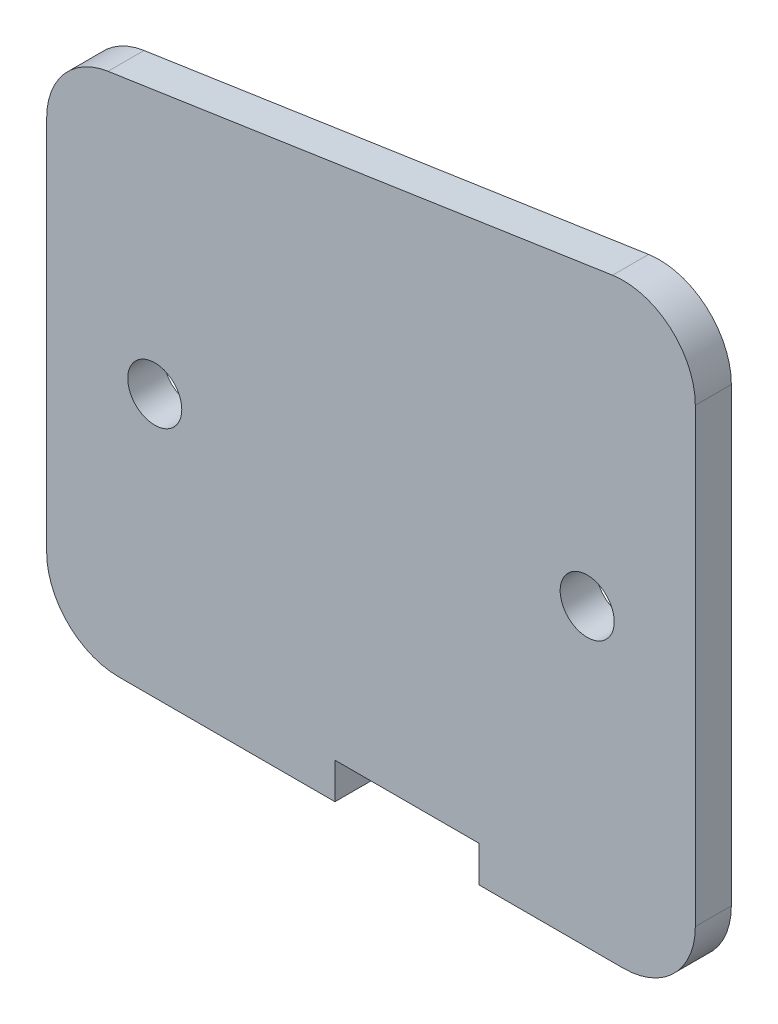
ISO-10303-21;
HEADER;
FILE_DESCRIPTION(('STEP AP214'),'2;1');
FILE_NAME('part.step','',(''),(''),'','','');
FILE_SCHEMA(('AUTOMOTIVE_DESIGN { 1 0 10303 214 1 1 1 1 }'));
ENDSEC;
DATA;
#1=APPLICATION_CONTEXT('core data for automotive mechanical design processes');
#2=APPLICATION_PROTOCOL_DEFINITION('international standard','automotive_design',2000,#1);
#3=PRODUCT_CONTEXT('',#1,'mechanical');
#4=PRODUCT('Part','Part','',(#3));
#5=PRODUCT_RELATED_PRODUCT_CATEGORY('part','',(#4));
#6=PRODUCT_DEFINITION_FORMATION('','',#4);
#7=PRODUCT_DEFINITION_CONTEXT('part definition',#1,'design');
#8=PRODUCT_DEFINITION('design','',#6,#7);
#9=PRODUCT_DEFINITION_SHAPE('','',#8);
#10=(LENGTH_UNIT() NAMED_UNIT(*) SI_UNIT(.MILLI.,.METRE.));
#11=(NAMED_UNIT(*) PLANE_ANGLE_UNIT() SI_UNIT($,.RADIAN.));
#12=(NAMED_UNIT(*) SI_UNIT($,.STERADIAN.) SOLID_ANGLE_UNIT());
#13=UNCERTAINTY_MEASURE_WITH_UNIT(LENGTH_MEASURE(1.E-05),#10,'distance_accuracy_value','');
#14=(GEOMETRIC_REPRESENTATION_CONTEXT(3) GLOBAL_UNCERTAINTY_ASSIGNED_CONTEXT((#13)) GLOBAL_UNIT_ASSIGNED_CONTEXT((#10,
#11,#12)) REPRESENTATION_CONTEXT('',''));
#15=CARTESIAN_POINT('',(0.,0.,0.));
#16=DIRECTION('',(0.,0.,1.));
#17=DIRECTION('',(1.,0.,0.));
#18=AXIS2_PLACEMENT_3D('',#15,#16,#17);
#19=CARTESIAN_POINT('',(-73.025,46.1252098778702,3.175));
#20=DIRECTION('',(0.,0.,-1.));
#21=DIRECTION('',(-1.,0.,0.));
#22=AXIS2_PLACEMENT_3D('',#19,#20,#21);
#23=CYLINDRICAL_SURFACE('',#22,6.35);
#24=CARTESIAN_POINT('',(-73.025,46.1252098778702,0.));
#25=DIRECTION('',(0.,0.,1.));
#26=DIRECTION('',(1.,0.,0.));
#27=AXIS2_PLACEMENT_3D('',#24,#25,#26);
#28=CIRCLE('',#27,6.35);
#29=CARTESIAN_POINT('',(-66.675,46.1252098778702,0.));
#30=VERTEX_POINT('',#29);
#31=CARTESIAN_POINT('',(-73.9669618761071,52.4049557185839,0.));
#32=VERTEX_POINT('',#31);
#33=EDGE_CURVE('E160',#30,#32,#28,.T.);
#34=ORIENTED_EDGE('',*,*,#33,.T.);
#35=DIRECTION('',(0.,0.,-1.));
#36=VECTOR('',#35,1.);
#37=CARTESIAN_POINT('',(-73.9669618761071,52.4049557185839,3.175));
#38=LINE('',#37,#36);
#39=CARTESIAN_POINT('',(-73.9669618761071,52.4049557185839,3.175));
#40=VERTEX_POINT('',#39);
#41=EDGE_CURVE('E11',#40,#32,#38,.T.);
#42=ORIENTED_EDGE('',*,*,#41,.F.);
#43=CARTESIAN_POINT('',(-73.025,46.1252098778702,3.175));
#44=DIRECTION('',(0.,0.,1.));
#45=DIRECTION('',(1.,0.,0.));
#46=AXIS2_PLACEMENT_3D('',#43,#44,#45);
#47=CIRCLE('',#46,6.35);
#48=CARTESIAN_POINT('',(-66.675,46.1252098778702,3.175));
#49=VERTEX_POINT('',#48);
#50=EDGE_CURVE('E100',#49,#40,#47,.T.);
#51=ORIENTED_EDGE('',*,*,#50,.F.);
#52=DIRECTION('',(0.,0.,-1.));
#53=VECTOR('',#52,1.);
#54=CARTESIAN_POINT('',(-66.675,46.1252098778702,3.175));
#55=LINE('',#54,#53);
#56=EDGE_CURVE('E51',#49,#30,#55,.T.);
#57=ORIENTED_EDGE('',*,*,#56,.T.);
#58=EDGE_LOOP('',(#34,#42,#51,#57));
#59=FACE_BOUND('',#58,.T.);
#60=ADVANCED_FACE('F35',(#59),#23,.T.);
#61=CARTESIAN_POINT('',(-9.31540342298289,62.1026894865526,3.175));
#62=DIRECTION('',(-0.148340452930245,0.988936352868297,0.));
#63=DIRECTION('',(-0.988936352868298,-0.148340452930245,0.));
#64=AXIS2_PLACEMENT_3D('',#61,#62,#63);
#65=PLANE('',#64);
#66=DIRECTION('',(0.988936352868298,0.148340452930245,0.));
#67=VECTOR('',#66,1.);
#68=CARTESIAN_POINT('',(-9.31540342298289,62.1026894865526,0.));
#69=LINE('',#68,#67);
#70=CARTESIAN_POINT('',(-118.416961876107,45.7374557185839,0.));
#71=VERTEX_POINT('',#70);
#72=EDGE_CURVE('E162',#71,#32,#69,.T.);
#73=ORIENTED_EDGE('',*,*,#72,.F.);
#74=DIRECTION('',(0.,0.,-1.));
#75=VECTOR('',#74,1.);
#76=CARTESIAN_POINT('',(-118.416961876107,45.7374557185839,3.175));
#77=LINE('',#76,#75);
#78=CARTESIAN_POINT('',(-118.416961876107,45.7374557185839,3.175));
#79=VERTEX_POINT('',#78);
#80=EDGE_CURVE('E43',#79,#71,#77,.T.);
#81=ORIENTED_EDGE('',*,*,#80,.F.);
#82=DIRECTION('',(0.988936352868298,0.148340452930245,0.));
#83=VECTOR('',#82,1.);
#84=CARTESIAN_POINT('',(-9.31540342298289,62.1026894865526,3.175));
#85=LINE('',#84,#83);
#86=EDGE_CURVE('E271',#79,#40,#85,.T.);
#87=ORIENTED_EDGE('',*,*,#86,.T.);
#88=ORIENTED_EDGE('',*,*,#41,.T.);
#89=EDGE_LOOP('',(#73,#81,#87,#88));
#90=FACE_BOUND('',#89,.T.);
#91=ADVANCED_FACE('F221',(#90),#65,.T.);
#92=CARTESIAN_POINT('',(-117.475,39.4577098778702,3.175));
#93=DIRECTION('',(0.,0.,-1.));
#94=DIRECTION('',(-1.,0.,0.));
#95=AXIS2_PLACEMENT_3D('',#92,#93,#94);
#96=CYLINDRICAL_SURFACE('',#95,6.35);
#97=CARTESIAN_POINT('',(-117.475,39.4577098778702,0.));
#98=DIRECTION('',(0.,0.,1.));
#99=DIRECTION('',(1.,0.,0.));
#100=AXIS2_PLACEMENT_3D('',#97,#98,#99);
#101=CIRCLE('',#100,6.35);
#102=CARTESIAN_POINT('',(-123.825,39.4577098778702,0.));
#103=VERTEX_POINT('',#102);
#104=EDGE_CURVE('E165',#103,#71,#101,.F.);
#105=ORIENTED_EDGE('',*,*,#104,.F.);
#106=DIRECTION('',(0.,0.,-1.));
#107=VECTOR('',#106,1.);
#108=CARTESIAN_POINT('',(-123.825,39.4577098778702,3.175));
#109=LINE('',#108,#107);
#110=CARTESIAN_POINT('',(-123.825,39.4577098778702,3.175));
#111=VERTEX_POINT('',#110);
#112=EDGE_CURVE('E211',#111,#103,#109,.T.);
#113=ORIENTED_EDGE('',*,*,#112,.F.);
#114=CARTESIAN_POINT('',(-117.475,39.4577098778702,3.175));
#115=DIRECTION('',(0.,0.,1.));
#116=DIRECTION('',(1.,0.,0.));
#117=AXIS2_PLACEMENT_3D('',#114,#115,#116);
#118=CIRCLE('',#117,6.35);
#119=EDGE_CURVE('E218',#111,#79,#118,.F.);
#120=ORIENTED_EDGE('',*,*,#119,.T.);
#121=ORIENTED_EDGE('',*,*,#80,.T.);
#122=EDGE_LOOP('',(#105,#113,#120,#121));
#123=FACE_BOUND('',#122,.T.);
#124=ADVANCED_FACE('F216',(#123),#96,.T.);
#125=CARTESIAN_POINT('',(-123.825,0.,3.175));
#126=DIRECTION('',(1.,0.,0.));
#127=DIRECTION('',(0.,0.,-1.));
#128=AXIS2_PLACEMENT_3D('',#125,#126,#127);
#129=PLANE('',#128);
#130=DIRECTION('',(0.,-1.,0.));
#131=VECTOR('',#130,1.);
#132=CARTESIAN_POINT('',(-123.825,0.,0.));
#133=LINE('',#132,#131);
#134=CARTESIAN_POINT('',(-123.825,6.35000000000003,0.));
#135=VERTEX_POINT('',#134);
#136=EDGE_CURVE('E168',#103,#135,#133,.T.);
#137=ORIENTED_EDGE('',*,*,#136,.T.);
#138=DIRECTION('',(0.,0.,-1.));
#139=VECTOR('',#138,1.);
#140=CARTESIAN_POINT('',(-123.825,6.35000000000003,3.175));
#141=LINE('',#140,#139);
#142=CARTESIAN_POINT('',(-123.825,6.35000000000003,3.175));
#143=VERTEX_POINT('',#142);
#144=EDGE_CURVE('E208',#143,#135,#141,.T.);
#145=ORIENTED_EDGE('',*,*,#144,.F.);
#146=DIRECTION('',(0.,-1.,0.));
#147=VECTOR('',#146,1.);
#148=CARTESIAN_POINT('',(-123.825,0.,3.175));
#149=LINE('',#148,#147);
#150=EDGE_CURVE('E239',#111,#143,#149,.T.);
#151=ORIENTED_EDGE('',*,*,#150,.F.);
#152=ORIENTED_EDGE('',*,*,#112,.T.);
#153=EDGE_LOOP('',(#137,#145,#151,#152));
#154=FACE_BOUND('',#153,.T.);
#155=ADVANCED_FACE('F229',(#154),#129,.F.);
#156=CARTESIAN_POINT('',(-117.475,6.34999999999999,3.175));
#157=DIRECTION('',(0.,0.,-1.));
#158=DIRECTION('',(-1.,0.,0.));
#159=AXIS2_PLACEMENT_3D('',#156,#157,#158);
#160=CYLINDRICAL_SURFACE('',#159,6.35);
#161=CARTESIAN_POINT('',(-117.475,6.34999999999999,0.));
#162=DIRECTION('',(0.,0.,1.));
#163=DIRECTION('',(1.,0.,0.));
#164=AXIS2_PLACEMENT_3D('',#161,#162,#163);
#165=CIRCLE('',#164,6.35);
#166=CARTESIAN_POINT('',(-117.475,0.,0.));
#167=VERTEX_POINT('',#166);
#168=EDGE_CURVE('E170',#135,#167,#165,.T.);
#169=ORIENTED_EDGE('',*,*,#168,.T.);
#170=DIRECTION('',(0.,0.,-1.));
#171=VECTOR('',#170,1.);
#172=CARTESIAN_POINT('',(-117.475,0.,3.175));
#173=LINE('',#172,#171);
#174=CARTESIAN_POINT('',(-117.475,0.,3.175));
#175=VERTEX_POINT('',#174);
#176=EDGE_CURVE('E206',#175,#167,#173,.T.);
#177=ORIENTED_EDGE('',*,*,#176,.F.);
#178=CARTESIAN_POINT('',(-117.475,6.34999999999999,3.175));
#179=DIRECTION('',(0.,0.,1.));
#180=DIRECTION('',(1.,0.,0.));
#181=AXIS2_PLACEMENT_3D('',#178,#179,#180);
#182=CIRCLE('',#181,6.35);
#183=EDGE_CURVE('E235',#143,#175,#182,.T.);
#184=ORIENTED_EDGE('',*,*,#183,.F.);
#185=ORIENTED_EDGE('',*,*,#144,.T.);
#186=EDGE_LOOP('',(#169,#177,#184,#185));
#187=FACE_BOUND('',#186,.T.);
#188=ADVANCED_FACE('F233',(#187),#160,.T.);
#189=CARTESIAN_POINT('',(0.,-2.23787359528212E-13,3.175));
#190=DIRECTION('',(0.,-1.,0.));
#191=DIRECTION('',(1.,0.,0.));
#192=AXIS2_PLACEMENT_3D('',#189,#190,#191);
#193=PLANE('',#192);
#194=DIRECTION('',(-1.,0.,0.));
#195=VECTOR('',#194,1.);
#196=CARTESIAN_POINT('',(0.,-2.23787359528212E-13,0.));
#197=LINE('',#196,#195);
#198=CARTESIAN_POINT('',(-98.425,0.,0.));
#199=VERTEX_POINT('',#198);
#200=EDGE_CURVE('E173',#199,#167,#197,.T.);
#201=ORIENTED_EDGE('',*,*,#200,.F.);
#202=DIRECTION('',(0.,0.,-1.));
#203=VECTOR('',#202,1.);
#204=CARTESIAN_POINT('',(-98.425,0.,3.175));
#205=LINE('',#204,#203);
#206=CARTESIAN_POINT('',(-98.425,0.,3.175));
#207=VERTEX_POINT('',#206);
#208=EDGE_CURVE('E204',#207,#199,#205,.T.);
#209=ORIENTED_EDGE('',*,*,#208,.F.);
#210=DIRECTION('',(-1.,0.,0.));
#211=VECTOR('',#210,1.);
#212=CARTESIAN_POINT('',(0.,-2.23787359528212E-13,3.175));
#213=LINE('',#212,#211);
#214=EDGE_CURVE('E238',#207,#175,#213,.T.);
#215=ORIENTED_EDGE('',*,*,#214,.T.);
#216=ORIENTED_EDGE('',*,*,#176,.T.);
#217=EDGE_LOOP('',(#201,#209,#215,#216));
#218=FACE_BOUND('',#217,.T.);
#219=ADVANCED_FACE('F283',(#218),#193,.T.);
#220=CARTESIAN_POINT('',(-98.425,0.,3.175));
#221=DIRECTION('',(-1.,0.,0.));
#222=DIRECTION('',(0.,0.,1.));
#223=AXIS2_PLACEMENT_3D('',#220,#221,#222);
#224=PLANE('',#223);
#225=DIRECTION('',(0.,1.,0.));
#226=VECTOR('',#225,1.);
#227=CARTESIAN_POINT('',(-98.425,0.,0.));
#228=LINE('',#227,#226);
#229=CARTESIAN_POINT('',(-98.425,3.17499999999995,0.));
#230=VERTEX_POINT('',#229);
#231=EDGE_CURVE('E176',#199,#230,#228,.T.);
#232=ORIENTED_EDGE('',*,*,#231,.T.);
#233=DIRECTION('',(0.,0.,-1.));
#234=VECTOR('',#233,1.);
#235=CARTESIAN_POINT('',(-98.425,3.17499999999995,3.175));
#236=LINE('',#235,#234);
#237=CARTESIAN_POINT('',(-98.425,3.17499999999995,3.175));
#238=VERTEX_POINT('',#237);
#239=EDGE_CURVE('E201',#238,#230,#236,.T.);
#240=ORIENTED_EDGE('',*,*,#239,.F.);
#241=DIRECTION('',(0.,1.,0.));
#242=VECTOR('',#241,1.);
#243=CARTESIAN_POINT('',(-98.425,0.,3.175));
#244=LINE('',#243,#242);
#245=EDGE_CURVE('E241',#207,#238,#244,.T.);
#246=ORIENTED_EDGE('',*,*,#245,.F.);
#247=ORIENTED_EDGE('',*,*,#208,.T.);
#248=EDGE_LOOP('',(#232,#240,#246,#247));
#249=FACE_BOUND('',#248,.T.);
#250=ADVANCED_FACE('F286',(#249),#224,.F.);
#251=CARTESIAN_POINT('',(0.,3.17499999999995,3.175));
#252=DIRECTION('',(0.,1.,0.));
#253=DIRECTION('',(0.,0.,1.));
#254=AXIS2_PLACEMENT_3D('',#251,#252,#253);
#255=PLANE('',#254);
#256=DIRECTION('',(1.,0.,0.));
#257=VECTOR('',#256,1.);
#258=CARTESIAN_POINT('',(0.,3.17499999999995,0.));
#259=LINE('',#258,#257);
#260=CARTESIAN_POINT('',(-85.725,3.17499999999995,0.));
#261=VERTEX_POINT('',#260);
#262=EDGE_CURVE('E178',#230,#261,#259,.T.);
#263=ORIENTED_EDGE('',*,*,#262,.T.);
#264=DIRECTION('',(0.,0.,-1.));
#265=VECTOR('',#264,1.);
#266=CARTESIAN_POINT('',(-85.725,3.17499999999995,3.175));
#267=LINE('',#266,#265);
#268=CARTESIAN_POINT('',(-85.725,3.17499999999995,3.175));
#269=VERTEX_POINT('',#268);
#270=EDGE_CURVE('E199',#269,#261,#267,.T.);
#271=ORIENTED_EDGE('',*,*,#270,.F.);
#272=DIRECTION('',(1.,0.,0.));
#273=VECTOR('',#272,1.);
#274=CARTESIAN_POINT('',(0.,3.17499999999995,3.175));
#275=LINE('',#274,#273);
#276=EDGE_CURVE('E247',#238,#269,#275,.T.);
#277=ORIENTED_EDGE('',*,*,#276,.F.);
#278=ORIENTED_EDGE('',*,*,#239,.T.);
#279=EDGE_LOOP('',(#263,#271,#277,#278));
#280=FACE_BOUND('',#279,.T.);
#281=ADVANCED_FACE('F290',(#280),#255,.F.);
#282=CARTESIAN_POINT('',(-85.725,0.,3.175));
#283=DIRECTION('',(-1.,0.,0.));
#284=DIRECTION('',(0.,0.,1.));
#285=AXIS2_PLACEMENT_3D('',#282,#283,#284);
#286=PLANE('',#285);
#287=DIRECTION('',(0.,1.,0.));
#288=VECTOR('',#287,1.);
#289=CARTESIAN_POINT('',(-85.725,0.,0.));
#290=LINE('',#289,#288);
#291=CARTESIAN_POINT('',(-85.725,0.,0.));
#292=VERTEX_POINT('',#291);
#293=EDGE_CURVE('E181',#292,#261,#290,.T.);
#294=ORIENTED_EDGE('',*,*,#293,.F.);
#295=DIRECTION('',(0.,0.,-1.));
#296=VECTOR('',#295,1.);
#297=CARTESIAN_POINT('',(-85.725,0.,3.175));
#298=LINE('',#297,#296);
#299=CARTESIAN_POINT('',(-85.725,0.,3.175));
#300=VERTEX_POINT('',#299);
#301=EDGE_CURVE('E138',#300,#292,#298,.T.);
#302=ORIENTED_EDGE('',*,*,#301,.F.);
#303=DIRECTION('',(0.,1.,0.));
#304=VECTOR('',#303,1.);
#305=CARTESIAN_POINT('',(-85.725,0.,3.175));
#306=LINE('',#305,#304);
#307=EDGE_CURVE('E146',#300,#269,#306,.T.);
#308=ORIENTED_EDGE('',*,*,#307,.T.);
#309=ORIENTED_EDGE('',*,*,#270,.T.);
#310=EDGE_LOOP('',(#294,#302,#308,#309));
#311=FACE_BOUND('',#310,.T.);
#312=ADVANCED_FACE('F250',(#311),#286,.T.);
#313=CARTESIAN_POINT('',(0.,0.,3.175));
#314=DIRECTION('',(0.,-1.,0.));
#315=DIRECTION('',(1.,0.,0.));
#316=AXIS2_PLACEMENT_3D('',#313,#314,#315);
#317=PLANE('',#316);
#318=DIRECTION('',(-1.,0.,0.));
#319=VECTOR('',#318,1.);
#320=CARTESIAN_POINT('',(0.,0.,0.));
#321=LINE('',#320,#319);
#322=CARTESIAN_POINT('',(-73.025,0.,0.));
#323=VERTEX_POINT('',#322);
#324=EDGE_CURVE('E134',#323,#292,#321,.T.);
#325=ORIENTED_EDGE('',*,*,#324,.F.);
#326=DIRECTION('',(0.,0.,-1.));
#327=VECTOR('',#326,1.);
#328=CARTESIAN_POINT('',(-73.025,0.,3.175));
#329=LINE('',#328,#327);
#330=CARTESIAN_POINT('',(-73.025,0.,3.175));
#331=VERTEX_POINT('',#330);
#332=EDGE_CURVE('E129',#331,#323,#329,.T.);
#333=ORIENTED_EDGE('',*,*,#332,.F.);
#334=DIRECTION('',(-1.,0.,0.));
#335=VECTOR('',#334,1.);
#336=CARTESIAN_POINT('',(0.,0.,3.175));
#337=LINE('',#336,#335);
#338=EDGE_CURVE('E132',#331,#300,#337,.T.);
#339=ORIENTED_EDGE('',*,*,#338,.T.);
#340=ORIENTED_EDGE('',*,*,#301,.T.);
#341=EDGE_LOOP('',(#325,#333,#339,#340));
#342=FACE_BOUND('',#341,.T.);
#343=ADVANCED_FACE('F131',(#342),#317,.T.);
#344=CARTESIAN_POINT('',(-73.025,6.34999999999999,3.175));
#345=DIRECTION('',(0.,0.,-1.));
#346=DIRECTION('',(-1.,0.,0.));
#347=AXIS2_PLACEMENT_3D('',#344,#345,#346);
#348=CYLINDRICAL_SURFACE('',#347,6.35);
#349=CARTESIAN_POINT('',(-73.025,6.34999999999999,0.));
#350=DIRECTION('',(0.,0.,1.));
#351=DIRECTION('',(1.,0.,0.));
#352=AXIS2_PLACEMENT_3D('',#349,#350,#351);
#353=CIRCLE('',#352,6.35);
#354=CARTESIAN_POINT('',(-66.675,6.35000000000004,0.));
#355=VERTEX_POINT('',#354);
#356=EDGE_CURVE('E185',#355,#323,#353,.F.);
#357=ORIENTED_EDGE('',*,*,#356,.F.);
#358=DIRECTION('',(0.,0.,-1.));
#359=VECTOR('',#358,1.);
#360=CARTESIAN_POINT('',(-66.675,6.35000000000004,3.175));
#361=LINE('',#360,#359);
#362=CARTESIAN_POINT('',(-66.675,6.35000000000004,3.175));
#363=VERTEX_POINT('',#362);
#364=EDGE_CURVE('E88',#363,#355,#361,.T.);
#365=ORIENTED_EDGE('',*,*,#364,.F.);
#366=CARTESIAN_POINT('',(-73.025,6.34999999999999,3.175));
#367=DIRECTION('',(0.,0.,1.));
#368=DIRECTION('',(1.,0.,0.));
#369=AXIS2_PLACEMENT_3D('',#366,#367,#368);
#370=CIRCLE('',#369,6.35);
#371=EDGE_CURVE('E144',#363,#331,#370,.F.);
#372=ORIENTED_EDGE('',*,*,#371,.T.);
#373=ORIENTED_EDGE('',*,*,#332,.T.);
#374=EDGE_LOOP('',(#357,#365,#372,#373));
#375=FACE_BOUND('',#374,.T.);
#376=ADVANCED_FACE('F148',(#375),#348,.T.);
#377=CARTESIAN_POINT('',(-114.3,23.1774999999997,3.175));
#378=DIRECTION('',(0.,0.,-1.));
#379=DIRECTION('',(-1.,0.,0.));
#380=AXIS2_PLACEMENT_3D('',#377,#378,#379);
#381=CYLINDRICAL_SURFACE('',#380,2.38125000000001);
#382=CARTESIAN_POINT('',(-114.3,23.1774999999997,3.175));
#383=DIRECTION('',(0.,0.,1.));
#384=DIRECTION('',(1.,0.,0.));
#385=AXIS2_PLACEMENT_3D('',#382,#383,#384);
#386=CIRCLE('',#385,2.38125000000001);
#387=CARTESIAN_POINT('',(-111.91875,23.1774999999997,3.175));
#388=VERTEX_POINT('',#387);
#389=EDGE_CURVE('E151',#388,#388,#386,.T.);
#390=ORIENTED_EDGE('',*,*,#389,.T.);
#391=EDGE_LOOP('',(#390));
#392=FACE_BOUND('',#391,.T.);
#393=CARTESIAN_POINT('',(-114.3,23.1774999999997,0.));
#394=DIRECTION('',(0.,0.,1.));
#395=DIRECTION('',(1.,0.,0.));
#396=AXIS2_PLACEMENT_3D('',#393,#394,#395);
#397=CIRCLE('',#396,2.38125000000001);
#398=CARTESIAN_POINT('',(-111.91875,23.1774999999997,0.));
#399=VERTEX_POINT('',#398);
#400=EDGE_CURVE('E190',#399,#399,#397,.T.);
#401=ORIENTED_EDGE('',*,*,#400,.F.);
#402=EDGE_LOOP('',(#401));
#403=FACE_BOUND('',#402,.T.);
#404=ADVANCED_FACE('F256',(#392,#403),#381,.F.);
#405=CARTESIAN_POINT('',(-66.675,0.,3.175));
#406=DIRECTION('',(1.,0.,0.));
#407=DIRECTION('',(0.,1.,0.));
#408=AXIS2_PLACEMENT_3D('',#405,#406,#407);
#409=PLANE('',#408);
#410=DIRECTION('',(0.,-1.,0.));
#411=VECTOR('',#410,1.);
#412=CARTESIAN_POINT('',(-66.675,0.,0.));
#413=LINE('',#412,#411);
#414=EDGE_CURVE('E187',#30,#355,#413,.T.);
#415=ORIENTED_EDGE('',*,*,#414,.F.);
#416=ORIENTED_EDGE('',*,*,#56,.F.);
#417=DIRECTION('',(0.,-1.,0.));
#418=VECTOR('',#417,1.);
#419=CARTESIAN_POINT('',(-66.675,0.,3.175));
#420=LINE('',#419,#418);
#421=EDGE_CURVE('E149',#49,#363,#420,.T.);
#422=ORIENTED_EDGE('',*,*,#421,.T.);
#423=ORIENTED_EDGE('',*,*,#364,.T.);
#424=EDGE_LOOP('',(#415,#416,#422,#423));
#425=FACE_BOUND('',#424,.T.);
#426=ADVANCED_FACE('F253',(#425),#409,.T.);
#427=CARTESIAN_POINT('',(-76.2,26.0349999999998,3.175));
#428=DIRECTION('',(0.,0.,-1.));
#429=DIRECTION('',(-1.,0.,0.));
#430=AXIS2_PLACEMENT_3D('',#427,#428,#429);
#431=CYLINDRICAL_SURFACE('',#430,2.38125000000001);
#432=CARTESIAN_POINT('',(-76.2,26.0349999999998,3.175));
#433=DIRECTION('',(0.,0.,1.));
#434=DIRECTION('',(1.,0.,0.));
#435=AXIS2_PLACEMENT_3D('',#432,#433,#434);
#436=CIRCLE('',#435,2.38125000000001);
#437=CARTESIAN_POINT('',(-73.81875,26.0349999999998,3.175));
#438=VERTEX_POINT('',#437);
#439=EDGE_CURVE('E157',#438,#438,#436,.T.);
#440=ORIENTED_EDGE('',*,*,#439,.T.);
#441=EDGE_LOOP('',(#440));
#442=FACE_BOUND('',#441,.T.);
#443=CARTESIAN_POINT('',(-76.2,26.0349999999998,0.));
#444=DIRECTION('',(0.,0.,1.));
#445=DIRECTION('',(1.,0.,0.));
#446=AXIS2_PLACEMENT_3D('',#443,#444,#445);
#447=CIRCLE('',#446,2.38125000000001);
#448=CARTESIAN_POINT('',(-73.81875,26.0349999999998,0.));
#449=VERTEX_POINT('',#448);
#450=EDGE_CURVE('E193',#449,#449,#447,.T.);
#451=ORIENTED_EDGE('',*,*,#450,.F.);
#452=EDGE_LOOP('',(#451));
#453=FACE_BOUND('',#452,.T.);
#454=ADVANCED_FACE('F255',(#442,#453),#431,.F.);
#455=CARTESIAN_POINT('',(0.,0.,3.175));
#456=DIRECTION('',(0.,0.,1.));
#457=DIRECTION('',(1.,0.,0.));
#458=AXIS2_PLACEMENT_3D('',#455,#456,#457);
#459=PLANE('',#458);
#460=ORIENTED_EDGE('',*,*,#50,.T.);
#461=ORIENTED_EDGE('',*,*,#86,.F.);
#462=ORIENTED_EDGE('',*,*,#119,.F.);
#463=ORIENTED_EDGE('',*,*,#150,.T.);
#464=ORIENTED_EDGE('',*,*,#183,.T.);
#465=ORIENTED_EDGE('',*,*,#214,.F.);
#466=ORIENTED_EDGE('',*,*,#245,.T.);
#467=ORIENTED_EDGE('',*,*,#276,.T.);
#468=ORIENTED_EDGE('',*,*,#307,.F.);
#469=ORIENTED_EDGE('',*,*,#338,.F.);
#470=ORIENTED_EDGE('',*,*,#371,.F.);
#471=ORIENTED_EDGE('',*,*,#421,.F.);
#472=EDGE_LOOP('',(#460,#461,#462,#463,#464,#465,#466,#467,#468,#469,#470,#471));
#473=FACE_BOUND('',#472,.T.);
#474=ORIENTED_EDGE('',*,*,#389,.F.);
#475=EDGE_LOOP('',(#474));
#476=FACE_BOUND('',#475,.T.);
#477=ORIENTED_EDGE('',*,*,#439,.F.);
#478=EDGE_LOOP('',(#477));
#479=FACE_BOUND('',#478,.T.);
#480=ADVANCED_FACE('F142',(#473,#476,#479),#459,.T.);
#481=CARTESIAN_POINT('',(0.,0.,0.));
#482=DIRECTION('',(0.,0.,1.));
#483=DIRECTION('',(1.,0.,0.));
#484=AXIS2_PLACEMENT_3D('',#481,#482,#483);
#485=PLANE('',#484);
#486=ORIENTED_EDGE('',*,*,#33,.F.);
#487=ORIENTED_EDGE('',*,*,#414,.T.);
#488=ORIENTED_EDGE('',*,*,#356,.T.);
#489=ORIENTED_EDGE('',*,*,#324,.T.);
#490=ORIENTED_EDGE('',*,*,#293,.T.);
#491=ORIENTED_EDGE('',*,*,#262,.F.);
#492=ORIENTED_EDGE('',*,*,#231,.F.);
#493=ORIENTED_EDGE('',*,*,#200,.T.);
#494=ORIENTED_EDGE('',*,*,#168,.F.);
#495=ORIENTED_EDGE('',*,*,#136,.F.);
#496=ORIENTED_EDGE('',*,*,#104,.T.);
#497=ORIENTED_EDGE('',*,*,#72,.T.);
#498=EDGE_LOOP('',(#486,#487,#488,#489,#490,#491,#492,#493,#494,#495,#496,#497));
#499=FACE_BOUND('',#498,.T.);
#500=ORIENTED_EDGE('',*,*,#400,.T.);
#501=EDGE_LOOP('',(#500));
#502=FACE_BOUND('',#501,.T.);
#503=ORIENTED_EDGE('',*,*,#450,.T.);
#504=EDGE_LOOP('',(#503));
#505=FACE_BOUND('',#504,.T.);
#506=ADVANCED_FACE('F224',(#499,#502,#505),#485,.F.);
#507=CLOSED_SHELL('',(#60,#91,#124,#155,#188,#219,#250,#281,#312,#343,#376,#404,#426,#454,#480,#506));
#508=MANIFOLD_SOLID_BREP('B2',#507);
#509=ADVANCED_BREP_SHAPE_REPRESENTATION('',(#18,#508),#14);
#510=SHAPE_DEFINITION_REPRESENTATION(#9,#509);
ENDSEC;
END-ISO-10303-21;
